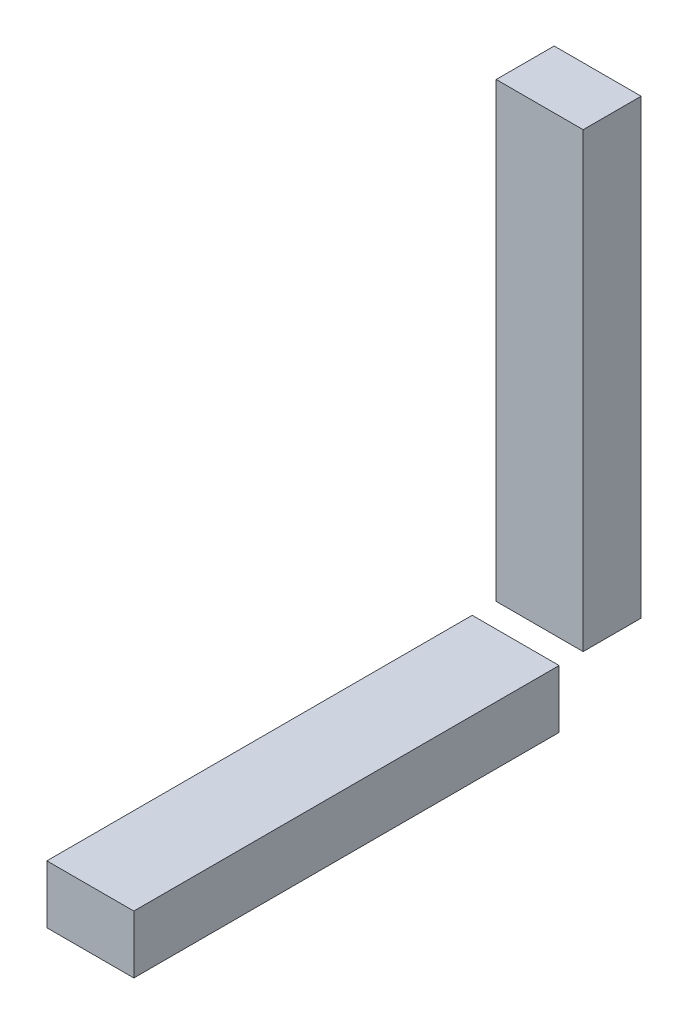
ISO-10303-21;
HEADER;
FILE_DESCRIPTION(('STEP AP214'),'2;1');
FILE_NAME('part.step','',(''),(''),'','','');
FILE_SCHEMA(('AUTOMOTIVE_DESIGN { 1 0 10303 214 1 1 1 1 }'));
ENDSEC;
DATA;
#1=APPLICATION_CONTEXT('core data for automotive mechanical design processes');
#2=APPLICATION_PROTOCOL_DEFINITION('international standard','automotive_design',2000,#1);
#3=PRODUCT_CONTEXT('',#1,'mechanical');
#4=PRODUCT('Part','Part','',(#3));
#5=PRODUCT_RELATED_PRODUCT_CATEGORY('part','',(#4));
#6=PRODUCT_DEFINITION_FORMATION('','',#4);
#7=PRODUCT_DEFINITION_CONTEXT('part definition',#1,'design');
#8=PRODUCT_DEFINITION('design','',#6,#7);
#9=PRODUCT_DEFINITION_SHAPE('','',#8);
#10=(LENGTH_UNIT() NAMED_UNIT(*) SI_UNIT(.MILLI.,.METRE.));
#11=(NAMED_UNIT(*) PLANE_ANGLE_UNIT() SI_UNIT($,.RADIAN.));
#12=(NAMED_UNIT(*) SI_UNIT($,.STERADIAN.) SOLID_ANGLE_UNIT());
#13=UNCERTAINTY_MEASURE_WITH_UNIT(LENGTH_MEASURE(1.E-05),#10,'distance_accuracy_value','');
#14=(GEOMETRIC_REPRESENTATION_CONTEXT(3) GLOBAL_UNCERTAINTY_ASSIGNED_CONTEXT((#13)) GLOBAL_UNIT_ASSIGNED_CONTEXT((#10,
#11,#12)) REPRESENTATION_CONTEXT('',''));
#15=CARTESIAN_POINT('',(0.,0.,0.));
#16=DIRECTION('',(0.,0.,1.));
#17=DIRECTION('',(1.,0.,0.));
#18=AXIS2_PLACEMENT_3D('',#15,#16,#17);
#19=CARTESIAN_POINT('',(15.,-222.265,155.));
#20=DIRECTION('',(0.,0.,-1.));
#21=DIRECTION('',(0.,1.,0.));
#22=AXIS2_PLACEMENT_3D('',#19,#20,#21);
#23=PLANE('',#22);
#24=DIRECTION('',(0.,-1.,0.));
#25=VECTOR('',#24,1.);
#26=CARTESIAN_POINT('',(-15.,-222.265,155.));
#27=LINE('',#26,#25);
#28=CARTESIAN_POINT('',(-15.,-202.265,155.));
#29=VERTEX_POINT('',#28);
#30=CARTESIAN_POINT('',(-15.,-222.265,155.));
#31=VERTEX_POINT('',#30);
#32=EDGE_CURVE('E106',#29,#31,#27,.T.);
#33=ORIENTED_EDGE('',*,*,#32,.T.);
#34=DIRECTION('',(-1.,0.,0.));
#35=VECTOR('',#34,1.);
#36=CARTESIAN_POINT('',(15.,-222.265,155.));
#37=LINE('',#36,#35);
#38=CARTESIAN_POINT('',(15.,-222.265,155.));
#39=VERTEX_POINT('',#38);
#40=EDGE_CURVE('E12',#39,#31,#37,.T.);
#41=ORIENTED_EDGE('',*,*,#40,.F.);
#42=DIRECTION('',(0.,-1.,0.));
#43=VECTOR('',#42,1.);
#44=CARTESIAN_POINT('',(15.,-222.265,155.));
#45=LINE('',#44,#43);
#46=CARTESIAN_POINT('',(15.,-202.265,155.));
#47=VERTEX_POINT('',#46);
#48=EDGE_CURVE('E94',#47,#39,#45,.T.);
#49=ORIENTED_EDGE('',*,*,#48,.F.);
#50=DIRECTION('',(-1.,0.,0.));
#51=VECTOR('',#50,1.);
#52=CARTESIAN_POINT('',(15.,-202.265,155.));
#53=LINE('',#52,#51);
#54=EDGE_CURVE('E102',#47,#29,#53,.T.);
#55=ORIENTED_EDGE('',*,*,#54,.T.);
#56=EDGE_LOOP('',(#33,#41,#49,#55));
#57=FACE_BOUND('',#56,.T.);
#58=ADVANCED_FACE('F43',(#57),#23,.F.);
#59=CARTESIAN_POINT('',(15.,-222.265,8.28427124746174));
#60=DIRECTION('',(0.,1.,0.));
#61=DIRECTION('',(0.,0.,1.));
#62=AXIS2_PLACEMENT_3D('',#59,#60,#61);
#63=PLANE('',#62);
#64=DIRECTION('',(0.,0.,-1.));
#65=VECTOR('',#64,1.);
#66=CARTESIAN_POINT('',(-15.,-222.265,8.28427124746174));
#67=LINE('',#66,#65);
#68=CARTESIAN_POINT('',(-15.,-222.265,8.28427124746174));
#69=VERTEX_POINT('',#68);
#70=EDGE_CURVE('E98',#31,#69,#67,.T.);
#71=ORIENTED_EDGE('',*,*,#70,.T.);
#72=DIRECTION('',(-1.,0.,0.));
#73=VECTOR('',#72,1.);
#74=CARTESIAN_POINT('',(15.,-222.265,8.28427124746174));
#75=LINE('',#74,#73);
#76=CARTESIAN_POINT('',(15.,-222.265,8.28427124746174));
#77=VERTEX_POINT('',#76);
#78=EDGE_CURVE('E51',#77,#69,#75,.T.);
#79=ORIENTED_EDGE('',*,*,#78,.F.);
#80=DIRECTION('',(0.,0.,-1.));
#81=VECTOR('',#80,1.);
#82=CARTESIAN_POINT('',(15.,-222.265,8.28427124746174));
#83=LINE('',#82,#81);
#84=EDGE_CURVE('E89',#39,#77,#83,.T.);
#85=ORIENTED_EDGE('',*,*,#84,.F.);
#86=ORIENTED_EDGE('',*,*,#40,.T.);
#87=EDGE_LOOP('',(#71,#79,#85,#86));
#88=FACE_BOUND('',#87,.T.);
#89=ADVANCED_FACE('F97',(#88),#63,.F.);
#90=CARTESIAN_POINT('',(15.,-202.265,8.28427124746174));
#91=DIRECTION('',(0.,0.,1.));
#92=DIRECTION('',(0.,-1.,0.));
#93=AXIS2_PLACEMENT_3D('',#90,#91,#92);
#94=PLANE('',#93);
#95=DIRECTION('',(0.,1.,0.));
#96=VECTOR('',#95,1.);
#97=CARTESIAN_POINT('',(-15.,-202.265,8.28427124746174));
#98=LINE('',#97,#96);
#99=CARTESIAN_POINT('',(-15.,-202.265,8.28427124746174));
#100=VERTEX_POINT('',#99);
#101=EDGE_CURVE('E76',#69,#100,#98,.T.);
#102=ORIENTED_EDGE('',*,*,#101,.T.);
#103=DIRECTION('',(-1.,0.,0.));
#104=VECTOR('',#103,1.);
#105=CARTESIAN_POINT('',(15.,-202.265,8.28427124746174));
#106=LINE('',#105,#104);
#107=CARTESIAN_POINT('',(15.,-202.265,8.28427124746174));
#108=VERTEX_POINT('',#107);
#109=EDGE_CURVE('E99',#108,#100,#106,.T.);
#110=ORIENTED_EDGE('',*,*,#109,.F.);
#111=DIRECTION('',(0.,1.,0.));
#112=VECTOR('',#111,1.);
#113=CARTESIAN_POINT('',(15.,-202.265,8.28427124746174));
#114=LINE('',#113,#112);
#115=EDGE_CURVE('E92',#77,#108,#114,.T.);
#116=ORIENTED_EDGE('',*,*,#115,.F.);
#117=ORIENTED_EDGE('',*,*,#78,.T.);
#118=EDGE_LOOP('',(#102,#110,#116,#117));
#119=FACE_BOUND('',#118,.T.);
#120=ADVANCED_FACE('F100',(#119),#94,.F.);
#121=CARTESIAN_POINT('',(15.,-202.265,155.));
#122=DIRECTION('',(0.,-1.,0.));
#123=DIRECTION('',(0.,0.,-1.));
#124=AXIS2_PLACEMENT_3D('',#121,#122,#123);
#125=PLANE('',#124);
#126=DIRECTION('',(0.,0.,1.));
#127=VECTOR('',#126,1.);
#128=CARTESIAN_POINT('',(-15.,-202.265,155.));
#129=LINE('',#128,#127);
#130=EDGE_CURVE('E82',#100,#29,#129,.T.);
#131=ORIENTED_EDGE('',*,*,#130,.T.);
#132=ORIENTED_EDGE('',*,*,#54,.F.);
#133=DIRECTION('',(0.,0.,1.));
#134=VECTOR('',#133,1.);
#135=CARTESIAN_POINT('',(15.,-202.265,155.));
#136=LINE('',#135,#134);
#137=EDGE_CURVE('E59',#108,#47,#136,.T.);
#138=ORIENTED_EDGE('',*,*,#137,.F.);
#139=ORIENTED_EDGE('',*,*,#109,.T.);
#140=EDGE_LOOP('',(#131,#132,#138,#139));
#141=FACE_BOUND('',#140,.T.);
#142=ADVANCED_FACE('F113',(#141),#125,.F.);
#143=CARTESIAN_POINT('',(15.,0.,0.));
#144=DIRECTION('',(-1.,0.,0.));
#145=DIRECTION('',(0.,0.,1.));
#146=AXIS2_PLACEMENT_3D('',#143,#144,#145);
#147=PLANE('',#146);
#148=ORIENTED_EDGE('',*,*,#48,.T.);
#149=ORIENTED_EDGE('',*,*,#84,.T.);
#150=ORIENTED_EDGE('',*,*,#115,.T.);
#151=ORIENTED_EDGE('',*,*,#137,.T.);
#152=EDGE_LOOP('',(#148,#149,#150,#151));
#153=FACE_BOUND('',#152,.T.);
#154=ADVANCED_FACE('F90',(#153),#147,.F.);
#155=CARTESIAN_POINT('',(-15.,0.,0.));
#156=DIRECTION('',(-1.,0.,0.));
#157=DIRECTION('',(0.,0.,1.));
#158=AXIS2_PLACEMENT_3D('',#155,#156,#157);
#159=PLANE('',#158);
#160=ORIENTED_EDGE('',*,*,#32,.F.);
#161=ORIENTED_EDGE('',*,*,#130,.F.);
#162=ORIENTED_EDGE('',*,*,#101,.F.);
#163=ORIENTED_EDGE('',*,*,#70,.F.);
#164=EDGE_LOOP('',(#160,#161,#162,#163));
#165=FACE_BOUND('',#164,.T.);
#166=ADVANCED_FACE('F116',(#165),#159,.T.);
#167=CLOSED_SHELL('',(#58,#89,#120,#142,#154,#166));
#168=MANIFOLD_SOLID_BREP('B2',#167);
#169=CARTESIAN_POINT('',(15.,-46.3366632208372,-20.));
#170=DIRECTION('',(1.,0.,0.));
#171=DIRECTION('',(0.,1.,0.));
#172=AXIS2_PLACEMENT_3D('',#169,#170,#171);
#173=PLANE('',#172);
#174=DIRECTION('',(0.,1.,0.));
#175=VECTOR('',#174,1.);
#176=CARTESIAN_POINT('',(15.,-46.3366632208372,0.));
#177=LINE('',#176,#175);
#178=CARTESIAN_POINT('',(15.,-202.265,0.));
#179=VERTEX_POINT('',#178);
#180=CARTESIAN_POINT('',(15.,-46.3366632208372,0.));
#181=VERTEX_POINT('',#180);
#182=EDGE_CURVE('E231',#179,#181,#177,.T.);
#183=ORIENTED_EDGE('',*,*,#182,.F.);
#184=DIRECTION('',(0.,0.,1.));
#185=VECTOR('',#184,1.);
#186=CARTESIAN_POINT('',(15.,-202.265,-20.));
#187=LINE('',#186,#185);
#188=CARTESIAN_POINT('',(15.,-202.265,-20.));
#189=VERTEX_POINT('',#188);
#190=EDGE_CURVE('E41',#189,#179,#187,.T.);
#191=ORIENTED_EDGE('',*,*,#190,.F.);
#192=DIRECTION('',(0.,1.,0.));
#193=VECTOR('',#192,1.);
#194=CARTESIAN_POINT('',(15.,-46.3366632208372,-20.));
#195=LINE('',#194,#193);
#196=CARTESIAN_POINT('',(15.,-46.3366632208372,-20.));
#197=VERTEX_POINT('',#196);
#198=EDGE_CURVE('E225',#189,#197,#195,.T.);
#199=ORIENTED_EDGE('',*,*,#198,.T.);
#200=DIRECTION('',(0.,0.,1.));
#201=VECTOR('',#200,1.);
#202=CARTESIAN_POINT('',(15.,-46.3366632208372,-20.));
#203=LINE('',#202,#201);
#204=EDGE_CURVE('E170',#197,#181,#203,.T.);
#205=ORIENTED_EDGE('',*,*,#204,.T.);
#206=EDGE_LOOP('',(#183,#191,#199,#205));
#207=FACE_BOUND('',#206,.T.);
#208=ADVANCED_FACE('F167',(#207),#173,.T.);
#209=CARTESIAN_POINT('',(15.,-202.265,-20.));
#210=DIRECTION('',(0.,-1.,0.));
#211=DIRECTION('',(0.,0.,-1.));
#212=AXIS2_PLACEMENT_3D('',#209,#210,#211);
#213=PLANE('',#212);
#214=DIRECTION('',(1.,0.,0.));
#215=VECTOR('',#214,1.);
#216=CARTESIAN_POINT('',(15.,-202.265,0.));
#217=LINE('',#216,#215);
#218=CARTESIAN_POINT('',(-15.,-202.265,0.));
#219=VERTEX_POINT('',#218);
#220=EDGE_CURVE('E227',#219,#179,#217,.T.);
#221=ORIENTED_EDGE('',*,*,#220,.F.);
#222=DIRECTION('',(0.,0.,1.));
#223=VECTOR('',#222,1.);
#224=CARTESIAN_POINT('',(-15.,-202.265,-20.));
#225=LINE('',#224,#223);
#226=CARTESIAN_POINT('',(-15.,-202.265,-20.));
#227=VERTEX_POINT('',#226);
#228=EDGE_CURVE('E176',#227,#219,#225,.T.);
#229=ORIENTED_EDGE('',*,*,#228,.F.);
#230=DIRECTION('',(1.,0.,0.));
#231=VECTOR('',#230,1.);
#232=CARTESIAN_POINT('',(15.,-202.265,-20.));
#233=LINE('',#232,#231);
#234=EDGE_CURVE('E222',#227,#189,#233,.T.);
#235=ORIENTED_EDGE('',*,*,#234,.T.);
#236=ORIENTED_EDGE('',*,*,#190,.T.);
#237=EDGE_LOOP('',(#221,#229,#235,#236));
#238=FACE_BOUND('',#237,.T.);
#239=ADVANCED_FACE('F241',(#238),#213,.T.);
#240=CARTESIAN_POINT('',(-15.,-46.3366632208372,-20.));
#241=DIRECTION('',(-1.,0.,0.));
#242=DIRECTION('',(0.,-1.,0.));
#243=AXIS2_PLACEMENT_3D('',#240,#241,#242);
#244=PLANE('',#243);
#245=DIRECTION('',(0.,-1.,0.));
#246=VECTOR('',#245,1.);
#247=CARTESIAN_POINT('',(-15.,-46.3366632208372,0.));
#248=LINE('',#247,#246);
#249=CARTESIAN_POINT('',(-15.,-46.3366632208372,0.));
#250=VERTEX_POINT('',#249);
#251=EDGE_CURVE('E217',#250,#219,#248,.T.);
#252=ORIENTED_EDGE('',*,*,#251,.F.);
#253=DIRECTION('',(0.,0.,1.));
#254=VECTOR('',#253,1.);
#255=CARTESIAN_POINT('',(-15.,-46.3366632208372,-20.));
#256=LINE('',#255,#254);
#257=CARTESIAN_POINT('',(-15.,-46.3366632208372,-20.));
#258=VERTEX_POINT('',#257);
#259=EDGE_CURVE('E212',#258,#250,#256,.T.);
#260=ORIENTED_EDGE('',*,*,#259,.F.);
#261=DIRECTION('',(0.,-1.,0.));
#262=VECTOR('',#261,1.);
#263=CARTESIAN_POINT('',(-15.,-46.3366632208372,-20.));
#264=LINE('',#263,#262);
#265=EDGE_CURVE('E215',#258,#227,#264,.T.);
#266=ORIENTED_EDGE('',*,*,#265,.T.);
#267=ORIENTED_EDGE('',*,*,#228,.T.);
#268=EDGE_LOOP('',(#252,#260,#266,#267));
#269=FACE_BOUND('',#268,.T.);
#270=ADVANCED_FACE('F214',(#269),#244,.T.);
#271=CARTESIAN_POINT('',(15.,-46.3366632208372,-20.));
#272=DIRECTION('',(0.,1.,0.));
#273=DIRECTION('',(0.,0.,1.));
#274=AXIS2_PLACEMENT_3D('',#271,#272,#273);
#275=PLANE('',#274);
#276=DIRECTION('',(-1.,0.,0.));
#277=VECTOR('',#276,1.);
#278=CARTESIAN_POINT('',(15.,-46.3366632208372,0.));
#279=LINE('',#278,#277);
#280=EDGE_CURVE('E234',#181,#250,#279,.T.);
#281=ORIENTED_EDGE('',*,*,#280,.F.);
#282=ORIENTED_EDGE('',*,*,#204,.F.);
#283=DIRECTION('',(-1.,0.,0.));
#284=VECTOR('',#283,1.);
#285=CARTESIAN_POINT('',(15.,-46.3366632208372,-20.));
#286=LINE('',#285,#284);
#287=EDGE_CURVE('E221',#197,#258,#286,.T.);
#288=ORIENTED_EDGE('',*,*,#287,.T.);
#289=ORIENTED_EDGE('',*,*,#259,.T.);
#290=EDGE_LOOP('',(#281,#282,#288,#289));
#291=FACE_BOUND('',#290,.T.);
#292=ADVANCED_FACE('F224',(#291),#275,.T.);
#293=CARTESIAN_POINT('',(0.,0.,-20.));
#294=DIRECTION('',(0.,0.,-1.));
#295=DIRECTION('',(-1.,0.,0.));
#296=AXIS2_PLACEMENT_3D('',#293,#294,#295);
#297=PLANE('',#296);
#298=ORIENTED_EDGE('',*,*,#198,.F.);
#299=ORIENTED_EDGE('',*,*,#234,.F.);
#300=ORIENTED_EDGE('',*,*,#265,.F.);
#301=ORIENTED_EDGE('',*,*,#287,.F.);
#302=EDGE_LOOP('',(#298,#299,#300,#301));
#303=FACE_BOUND('',#302,.T.);
#304=ADVANCED_FACE('F220',(#303),#297,.T.);
#305=CARTESIAN_POINT('',(0.,0.,0.));
#306=DIRECTION('',(0.,0.,-1.));
#307=DIRECTION('',(-1.,0.,0.));
#308=AXIS2_PLACEMENT_3D('',#305,#306,#307);
#309=PLANE('',#308);
#310=ORIENTED_EDGE('',*,*,#182,.T.);
#311=ORIENTED_EDGE('',*,*,#280,.T.);
#312=ORIENTED_EDGE('',*,*,#251,.T.);
#313=ORIENTED_EDGE('',*,*,#220,.T.);
#314=EDGE_LOOP('',(#310,#311,#312,#313));
#315=FACE_BOUND('',#314,.T.);
#316=ADVANCED_FACE('F240',(#315),#309,.F.);
#317=CLOSED_SHELL('',(#208,#239,#270,#292,#304,#316));
#318=MANIFOLD_SOLID_BREP('B6',#317);
#319=ADVANCED_BREP_SHAPE_REPRESENTATION('',(#18,#168,#318),#14);
#320=SHAPE_DEFINITION_REPRESENTATION(#9,#319);
ENDSEC;
END-ISO-10303-21;
